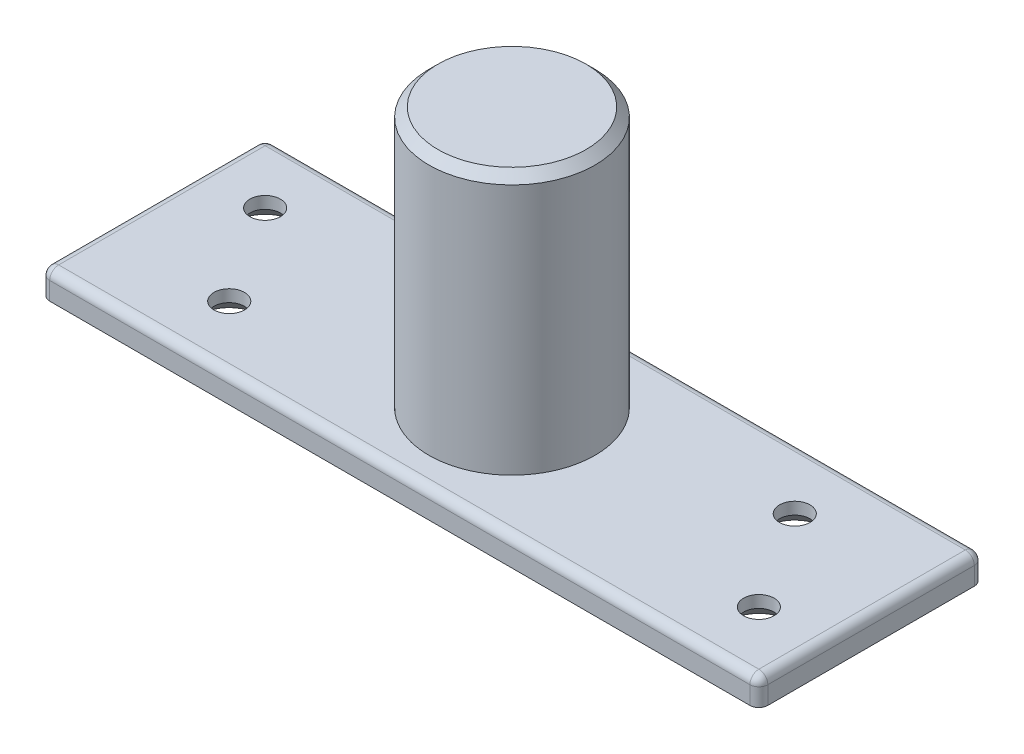
ISO-10303-21;
HEADER;
FILE_DESCRIPTION(('STEP AP214'),'2;1');
FILE_NAME('part.step','',(''),(''),'','','');
FILE_SCHEMA(('AUTOMOTIVE_DESIGN { 1 0 10303 214 1 1 1 1 }'));
ENDSEC;
DATA;
#1=APPLICATION_CONTEXT('core data for automotive mechanical design processes');
#2=APPLICATION_PROTOCOL_DEFINITION('international standard','automotive_design',2000,#1);
#3=PRODUCT_CONTEXT('',#1,'mechanical');
#4=PRODUCT('Part','Part','',(#3));
#5=PRODUCT_RELATED_PRODUCT_CATEGORY('part','',(#4));
#6=PRODUCT_DEFINITION_FORMATION('','',#4);
#7=PRODUCT_DEFINITION_CONTEXT('part definition',#1,'design');
#8=PRODUCT_DEFINITION('design','',#6,#7);
#9=PRODUCT_DEFINITION_SHAPE('','',#8);
#10=(LENGTH_UNIT() NAMED_UNIT(*) SI_UNIT(.MILLI.,.METRE.));
#11=(NAMED_UNIT(*) PLANE_ANGLE_UNIT() SI_UNIT($,.RADIAN.));
#12=(NAMED_UNIT(*) SI_UNIT($,.STERADIAN.) SOLID_ANGLE_UNIT());
#13=UNCERTAINTY_MEASURE_WITH_UNIT(LENGTH_MEASURE(1.E-05),#10,'distance_accuracy_value','');
#14=(GEOMETRIC_REPRESENTATION_CONTEXT(3) GLOBAL_UNCERTAINTY_ASSIGNED_CONTEXT((#13)) GLOBAL_UNIT_ASSIGNED_CONTEXT((#10,
#11,#12)) REPRESENTATION_CONTEXT('',''));
#15=CARTESIAN_POINT('',(0.,0.,0.));
#16=DIRECTION('',(0.,0.,1.));
#17=DIRECTION('',(1.,0.,0.));
#18=AXIS2_PLACEMENT_3D('',#15,#16,#17);
#19=CARTESIAN_POINT('',(0.,30.5,0.));
#20=DIRECTION('',(0.,-1.,0.));
#21=DIRECTION('',(0.,0.,-1.));
#22=AXIS2_PLACEMENT_3D('',#19,#20,#21);
#23=CYLINDRICAL_SURFACE('',#22,9.25);
#24=CARTESIAN_POINT('',(0.,-0.499999999999997,0.));
#25=DIRECTION('',(0.,-1.,0.));
#26=DIRECTION('',(0.,0.,-1.));
#27=AXIS2_PLACEMENT_3D('',#24,#25,#26);
#28=CIRCLE('',#27,9.25);
#29=CARTESIAN_POINT('',(0.,-0.499999999999997,-9.25));
#30=VERTEX_POINT('',#29);
#31=EDGE_CURVE('E11',#30,#30,#28,.F.);
#32=ORIENTED_EDGE('',*,*,#31,.T.);
#33=EDGE_LOOP('',(#32));
#34=FACE_BOUND('',#33,.T.);
#35=CARTESIAN_POINT('',(0.,29.5,0.));
#36=DIRECTION('',(0.,-1.,0.));
#37=DIRECTION('',(0.,0.,-1.));
#38=AXIS2_PLACEMENT_3D('',#35,#36,#37);
#39=CIRCLE('',#38,9.25);
#40=CARTESIAN_POINT('',(0.,29.5,-9.25));
#41=VERTEX_POINT('',#40);
#42=EDGE_CURVE('E72',#41,#41,#39,.T.);
#43=ORIENTED_EDGE('',*,*,#42,.T.);
#44=EDGE_LOOP('',(#43));
#45=FACE_BOUND('',#44,.T.);
#46=ADVANCED_FACE('F48',(#34,#45),#23,.T.);
#47=CARTESIAN_POINT('',(0.,30.5,0.));
#48=DIRECTION('',(0.,-1.,0.));
#49=DIRECTION('',(0.,0.,-1.));
#50=AXIS2_PLACEMENT_3D('',#47,#48,#49);
#51=PLANE('',#50);
#52=CARTESIAN_POINT('',(0.,30.5,0.));
#53=DIRECTION('',(0.,-1.,0.));
#54=DIRECTION('',(0.,0.,-1.));
#55=AXIS2_PLACEMENT_3D('',#52,#53,#54);
#56=CIRCLE('',#55,8.25);
#57=CARTESIAN_POINT('',(0.,30.5,-8.25));
#58=VERTEX_POINT('',#57);
#59=EDGE_CURVE('E69',#58,#58,#56,.F.);
#60=ORIENTED_EDGE('',*,*,#59,.T.);
#61=EDGE_LOOP('',(#60));
#62=FACE_BOUND('',#61,.T.);
#63=ADVANCED_FACE('F92',(#62),#51,.F.);
#64=CARTESIAN_POINT('',(0.,-1.5,0.));
#65=DIRECTION('',(0.,-1.,0.));
#66=DIRECTION('',(0.,0.,-1.));
#67=AXIS2_PLACEMENT_3D('',#64,#65,#66);
#68=PLANE('',#67);
#69=CARTESIAN_POINT('',(0.,-1.5,0.));
#70=DIRECTION('',(0.,-1.,0.));
#71=DIRECTION('',(0.,0.,-1.));
#72=AXIS2_PLACEMENT_3D('',#69,#70,#71);
#73=CIRCLE('',#72,7.25000000000001);
#74=CARTESIAN_POINT('',(0.,-1.5,-7.25000000000001));
#75=VERTEX_POINT('',#74);
#76=EDGE_CURVE('E56',#75,#75,#73,.F.);
#77=ORIENTED_EDGE('',*,*,#76,.T.);
#78=EDGE_LOOP('',(#77));
#79=FACE_BOUND('',#78,.T.);
#80=CARTESIAN_POINT('',(0.,-1.5,0.));
#81=DIRECTION('',(0.,-1.,0.));
#82=DIRECTION('',(0.,0.,-1.));
#83=AXIS2_PLACEMENT_3D('',#80,#81,#82);
#84=CIRCLE('',#83,8.25);
#85=CARTESIAN_POINT('',(0.,-1.5,-8.25));
#86=VERTEX_POINT('',#85);
#87=EDGE_CURVE('E60',#86,#86,#84,.T.);
#88=ORIENTED_EDGE('',*,*,#87,.T.);
#89=EDGE_LOOP('',(#88));
#90=FACE_BOUND('',#89,.T.);
#91=ADVANCED_FACE('F83',(#79,#90),#68,.T.);
#92=CARTESIAN_POINT('',(0.,30.5,0.));
#93=DIRECTION('',(0.,-1.,0.));
#94=DIRECTION('',(0.,0.,-1.));
#95=AXIS2_PLACEMENT_3D('',#92,#93,#94);
#96=CYLINDRICAL_SURFACE('',#95,6.25);
#97=CARTESIAN_POINT('',(0.,-0.49999999999999,0.));
#98=DIRECTION('',(0.,-1.,0.));
#99=DIRECTION('',(0.,0.,-1.));
#100=AXIS2_PLACEMENT_3D('',#97,#98,#99);
#101=CIRCLE('',#100,6.25);
#102=CARTESIAN_POINT('',(0.,-0.49999999999999,-6.25));
#103=VERTEX_POINT('',#102);
#104=EDGE_CURVE('E64',#103,#103,#101,.T.);
#105=ORIENTED_EDGE('',*,*,#104,.T.);
#106=EDGE_LOOP('',(#105));
#107=FACE_BOUND('',#106,.T.);
#108=CARTESIAN_POINT('',(0.,27.5,0.));
#109=DIRECTION('',(0.,-1.,0.));
#110=DIRECTION('',(0.,0.,-1.));
#111=AXIS2_PLACEMENT_3D('',#108,#109,#110);
#112=CIRCLE('',#111,6.25);
#113=CARTESIAN_POINT('',(0.,27.5,-6.25));
#114=VERTEX_POINT('',#113);
#115=EDGE_CURVE('E75',#114,#114,#112,.T.);
#116=ORIENTED_EDGE('',*,*,#115,.F.);
#117=EDGE_LOOP('',(#116));
#118=FACE_BOUND('',#117,.T.);
#119=ADVANCED_FACE('F81',(#107,#118),#96,.F.);
#120=CARTESIAN_POINT('',(0.,27.5,0.));
#121=DIRECTION('',(0.,-1.,0.));
#122=DIRECTION('',(0.,0.,-1.));
#123=AXIS2_PLACEMENT_3D('',#120,#121,#122);
#124=PLANE('',#123);
#125=ORIENTED_EDGE('',*,*,#115,.T.);
#126=EDGE_LOOP('',(#125));
#127=FACE_BOUND('',#126,.T.);
#128=ADVANCED_FACE('F79',(#127),#124,.T.);
#129=CARTESIAN_POINT('',(0.,29.5,0.));
#130=DIRECTION('',(0.,-1.,0.));
#131=DIRECTION('',(0.,0.,-1.));
#132=AXIS2_PLACEMENT_3D('',#129,#130,#131);
#133=CONICAL_SURFACE('',#132,9.25,0.785398163397449);
#134=ORIENTED_EDGE('',*,*,#59,.F.);
#135=EDGE_LOOP('',(#134));
#136=FACE_BOUND('',#135,.T.);
#137=ORIENTED_EDGE('',*,*,#42,.F.);
#138=EDGE_LOOP('',(#137));
#139=FACE_BOUND('',#138,.T.);
#140=ADVANCED_FACE('F90',(#136,#139),#133,.T.);
#141=CARTESIAN_POINT('',(0.,-0.49999999999999,0.));
#142=DIRECTION('',(0.,-1.,0.));
#143=DIRECTION('',(0.,0.,-1.));
#144=AXIS2_PLACEMENT_3D('',#141,#142,#143);
#145=CONICAL_SURFACE('',#144,6.25,0.78539816339745);
#146=ORIENTED_EDGE('',*,*,#76,.F.);
#147=EDGE_LOOP('',(#146));
#148=FACE_BOUND('',#147,.T.);
#149=ORIENTED_EDGE('',*,*,#104,.F.);
#150=EDGE_LOOP('',(#149));
#151=FACE_BOUND('',#150,.T.);
#152=ADVANCED_FACE('F108',(#148,#151),#145,.F.);
#153=CARTESIAN_POINT('',(0.,-1.5,0.));
#154=DIRECTION('',(0.,1.,0.));
#155=DIRECTION('',(0.,0.,1.));
#156=AXIS2_PLACEMENT_3D('',#153,#154,#155);
#157=CONICAL_SURFACE('',#156,8.25,0.785398163397446);
#158=ORIENTED_EDGE('',*,*,#31,.F.);
#159=EDGE_LOOP('',(#158));
#160=FACE_BOUND('',#159,.T.);
#161=ORIENTED_EDGE('',*,*,#87,.F.);
#162=EDGE_LOOP('',(#161));
#163=FACE_BOUND('',#162,.T.);
#164=ADVANCED_FACE('F51',(#160,#163),#157,.T.);
#165=CLOSED_SHELL('',(#46,#63,#91,#119,#128,#140,#152,#164));
#166=MANIFOLD_SOLID_BREP('B2',#165);
#167=CARTESIAN_POINT('',(39.,1.5,11.5));
#168=DIRECTION('',(0.,1.,0.));
#169=DIRECTION('',(0.,0.,1.));
#170=AXIS2_PLACEMENT_3D('',#167,#168,#169);
#171=PLANE('',#170);
#172=CARTESIAN_POINT('',(26.,1.5,-5.5));
#173=DIRECTION('',(0.,1.,0.));
#174=DIRECTION('',(0.,0.,1.));
#175=AXIS2_PLACEMENT_3D('',#172,#173,#174);
#176=CIRCLE('',#175,1.7);
#177=CARTESIAN_POINT('',(26.,1.5,-3.8));
#178=VERTEX_POINT('',#177);
#179=EDGE_CURVE('E192',#178,#178,#176,.T.);
#180=ORIENTED_EDGE('',*,*,#179,.F.);
#181=EDGE_LOOP('',(#180));
#182=FACE_BOUND('',#181,.T.);
#183=CARTESIAN_POINT('',(33.,1.5,5.5));
#184=DIRECTION('',(0.,1.,0.));
#185=DIRECTION('',(0.,0.,1.));
#186=AXIS2_PLACEMENT_3D('',#183,#184,#185);
#187=CIRCLE('',#186,1.7);
#188=CARTESIAN_POINT('',(33.,1.5,7.2));
#189=VERTEX_POINT('',#188);
#190=EDGE_CURVE('E372',#189,#189,#187,.T.);
#191=ORIENTED_EDGE('',*,*,#190,.F.);
#192=EDGE_LOOP('',(#191));
#193=FACE_BOUND('',#192,.T.);
#194=CARTESIAN_POINT('',(-26.,1.5,5.5));
#195=DIRECTION('',(0.,1.,0.));
#196=DIRECTION('',(0.,0.,1.));
#197=AXIS2_PLACEMENT_3D('',#194,#195,#196);
#198=CIRCLE('',#197,1.7);
#199=CARTESIAN_POINT('',(-26.,1.5,7.2));
#200=VERTEX_POINT('',#199);
#201=EDGE_CURVE('E368',#200,#200,#198,.T.);
#202=ORIENTED_EDGE('',*,*,#201,.F.);
#203=EDGE_LOOP('',(#202));
#204=FACE_BOUND('',#203,.T.);
#205=CARTESIAN_POINT('',(-33.,1.5,-5.5));
#206=DIRECTION('',(0.,1.,0.));
#207=DIRECTION('',(0.,0.,1.));
#208=AXIS2_PLACEMENT_3D('',#205,#206,#207);
#209=CIRCLE('',#208,1.7);
#210=CARTESIAN_POINT('',(-33.,1.5,-3.8));
#211=VERTEX_POINT('',#210);
#212=EDGE_CURVE('E345',#211,#211,#209,.T.);
#213=ORIENTED_EDGE('',*,*,#212,.F.);
#214=EDGE_LOOP('',(#213));
#215=FACE_BOUND('',#214,.T.);
#216=DIRECTION('',(-1.,0.,0.));
#217=VECTOR('',#216,1.);
#218=CARTESIAN_POINT('',(-39.,1.5,-11.5));
#219=LINE('',#218,#217);
#220=CARTESIAN_POINT('',(39.,1.5,-11.5));
#221=VERTEX_POINT('',#220);
#222=CARTESIAN_POINT('',(-39.,1.5,-11.5));
#223=VERTEX_POINT('',#222);
#224=EDGE_CURVE('E327',#221,#223,#219,.T.);
#225=ORIENTED_EDGE('',*,*,#224,.T.);
#226=DIRECTION('',(0.,0.,1.));
#227=VECTOR('',#226,1.);
#228=CARTESIAN_POINT('',(-39.,1.5,11.5));
#229=LINE('',#228,#227);
#230=CARTESIAN_POINT('',(-39.,1.5,11.5));
#231=VERTEX_POINT('',#230);
#232=EDGE_CURVE('E329',#223,#231,#229,.T.);
#233=ORIENTED_EDGE('',*,*,#232,.T.);
#234=DIRECTION('',(1.,0.,0.));
#235=VECTOR('',#234,1.);
#236=CARTESIAN_POINT('',(39.,1.5,11.5));
#237=LINE('',#236,#235);
#238=CARTESIAN_POINT('',(39.,1.5,11.5));
#239=VERTEX_POINT('',#238);
#240=EDGE_CURVE('E323',#231,#239,#237,.T.);
#241=ORIENTED_EDGE('',*,*,#240,.T.);
#242=DIRECTION('',(0.,0.,-1.));
#243=VECTOR('',#242,1.);
#244=CARTESIAN_POINT('',(39.,1.5,-11.5));
#245=LINE('',#244,#243);
#246=EDGE_CURVE('E325',#239,#221,#245,.T.);
#247=ORIENTED_EDGE('',*,*,#246,.T.);
#248=EDGE_LOOP('',(#225,#233,#241,#247));
#249=FACE_BOUND('',#248,.T.);
#250=CARTESIAN_POINT('',(0.,1.5,0.));
#251=DIRECTION('',(0.,1.,0.));
#252=DIRECTION('',(0.,0.,1.));
#253=AXIS2_PLACEMENT_3D('',#250,#251,#252);
#254=CIRCLE('',#253,9.25);
#255=CARTESIAN_POINT('',(0.,1.5,9.25));
#256=VERTEX_POINT('',#255);
#257=EDGE_CURVE('E287',#256,#256,#254,.T.);
#258=ORIENTED_EDGE('',*,*,#257,.F.);
#259=EDGE_LOOP('',(#258));
#260=FACE_BOUND('',#259,.T.);
#261=ADVANCED_FACE('F188',(#182,#193,#204,#215,#249,#260),#171,.T.);
#262=CARTESIAN_POINT('',(39.,-1.5,11.5));
#263=DIRECTION('',(0.,1.,0.));
#264=DIRECTION('',(0.,0.,1.));
#265=AXIS2_PLACEMENT_3D('',#262,#263,#264);
#266=PLANE('',#265);
#267=CARTESIAN_POINT('',(26.,-1.5,-5.5));
#268=DIRECTION('',(0.,-1.,0.));
#269=DIRECTION('',(0.,0.,-1.));
#270=AXIS2_PLACEMENT_3D('',#267,#268,#269);
#271=CIRCLE('',#270,3.36);
#272=CARTESIAN_POINT('',(26.,-1.5,-8.86));
#273=VERTEX_POINT('',#272);
#274=EDGE_CURVE('E543',#273,#273,#271,.T.);
#275=ORIENTED_EDGE('',*,*,#274,.F.);
#276=EDGE_LOOP('',(#275));
#277=FACE_BOUND('',#276,.T.);
#278=CARTESIAN_POINT('',(33.,-1.5,5.5));
#279=DIRECTION('',(0.,-1.,0.));
#280=DIRECTION('',(0.,0.,-1.));
#281=AXIS2_PLACEMENT_3D('',#278,#279,#280);
#282=CIRCLE('',#281,3.36);
#283=CARTESIAN_POINT('',(33.,-1.5,2.14));
#284=VERTEX_POINT('',#283);
#285=EDGE_CURVE('E381',#284,#284,#282,.T.);
#286=ORIENTED_EDGE('',*,*,#285,.F.);
#287=EDGE_LOOP('',(#286));
#288=FACE_BOUND('',#287,.T.);
#289=CARTESIAN_POINT('',(-26.,-1.5,5.5));
#290=DIRECTION('',(0.,-1.,0.));
#291=DIRECTION('',(0.,0.,-1.));
#292=AXIS2_PLACEMENT_3D('',#289,#290,#291);
#293=CIRCLE('',#292,3.36);
#294=CARTESIAN_POINT('',(-26.,-1.5,2.14));
#295=VERTEX_POINT('',#294);
#296=EDGE_CURVE('E374',#295,#295,#293,.T.);
#297=ORIENTED_EDGE('',*,*,#296,.F.);
#298=EDGE_LOOP('',(#297));
#299=FACE_BOUND('',#298,.T.);
#300=CARTESIAN_POINT('',(-33.,-1.5,-5.5));
#301=DIRECTION('',(0.,-1.,0.));
#302=DIRECTION('',(0.,0.,-1.));
#303=AXIS2_PLACEMENT_3D('',#300,#301,#302);
#304=CIRCLE('',#303,3.36);
#305=CARTESIAN_POINT('',(-33.,-1.5,-8.86));
#306=VERTEX_POINT('',#305);
#307=EDGE_CURVE('E370',#306,#306,#304,.T.);
#308=ORIENTED_EDGE('',*,*,#307,.F.);
#309=EDGE_LOOP('',(#308));
#310=FACE_BOUND('',#309,.T.);
#311=CARTESIAN_POINT('',(39.,-1.5,11.5));
#312=DIRECTION('',(0.,1.,0.));
#313=DIRECTION('',(0.,0.,1.));
#314=AXIS2_PLACEMENT_3D('',#311,#312,#313);
#315=CIRCLE('',#314,1.);
#316=CARTESIAN_POINT('',(39.,-1.5,12.5));
#317=VERTEX_POINT('',#316);
#318=CARTESIAN_POINT('',(40.,-1.5,11.5));
#319=VERTEX_POINT('',#318);
#320=EDGE_CURVE('E279',#317,#319,#315,.T.);
#321=ORIENTED_EDGE('',*,*,#320,.F.);
#322=DIRECTION('',(1.,0.,0.));
#323=VECTOR('',#322,1.);
#324=CARTESIAN_POINT('',(-39.,-1.5,12.5));
#325=LINE('',#324,#323);
#326=CARTESIAN_POINT('',(-39.,-1.5,12.5));
#327=VERTEX_POINT('',#326);
#328=EDGE_CURVE('E307',#327,#317,#325,.T.);
#329=ORIENTED_EDGE('',*,*,#328,.F.);
#330=CARTESIAN_POINT('',(-39.,-1.5,11.5));
#331=DIRECTION('',(0.,1.,0.));
#332=DIRECTION('',(0.,0.,-1.));
#333=AXIS2_PLACEMENT_3D('',#330,#331,#332);
#334=CIRCLE('',#333,1.);
#335=CARTESIAN_POINT('',(-40.,-1.5,11.5));
#336=VERTEX_POINT('',#335);
#337=EDGE_CURVE('E304',#336,#327,#334,.T.);
#338=ORIENTED_EDGE('',*,*,#337,.F.);
#339=DIRECTION('',(0.,0.,1.));
#340=VECTOR('',#339,1.);
#341=CARTESIAN_POINT('',(-40.,-1.5,11.5));
#342=LINE('',#341,#340);
#343=CARTESIAN_POINT('',(-40.,-1.5,-11.5));
#344=VERTEX_POINT('',#343);
#345=EDGE_CURVE('E301',#344,#336,#342,.T.);
#346=ORIENTED_EDGE('',*,*,#345,.F.);
#347=CARTESIAN_POINT('',(-39.,-1.5,-11.5));
#348=DIRECTION('',(0.,1.,0.));
#349=DIRECTION('',(0.,0.,-1.));
#350=AXIS2_PLACEMENT_3D('',#347,#348,#349);
#351=CIRCLE('',#350,1.);
#352=CARTESIAN_POINT('',(-39.,-1.5,-12.5));
#353=VERTEX_POINT('',#352);
#354=EDGE_CURVE('E298',#353,#344,#351,.T.);
#355=ORIENTED_EDGE('',*,*,#354,.F.);
#356=DIRECTION('',(-1.,0.,0.));
#357=VECTOR('',#356,1.);
#358=CARTESIAN_POINT('',(-39.,-1.5,-12.5));
#359=LINE('',#358,#357);
#360=CARTESIAN_POINT('',(39.,-1.5,-12.5));
#361=VERTEX_POINT('',#360);
#362=EDGE_CURVE('E295',#361,#353,#359,.T.);
#363=ORIENTED_EDGE('',*,*,#362,.F.);
#364=CARTESIAN_POINT('',(39.,-1.5,-11.5));
#365=DIRECTION('',(0.,1.,0.));
#366=DIRECTION('',(0.,0.,-1.));
#367=AXIS2_PLACEMENT_3D('',#364,#365,#366);
#368=CIRCLE('',#367,1.);
#369=CARTESIAN_POINT('',(40.,-1.5,-11.5));
#370=VERTEX_POINT('',#369);
#371=EDGE_CURVE('E282',#370,#361,#368,.T.);
#372=ORIENTED_EDGE('',*,*,#371,.F.);
#373=DIRECTION('',(0.,0.,-1.));
#374=VECTOR('',#373,1.);
#375=CARTESIAN_POINT('',(40.,-1.5,11.5));
#376=LINE('',#375,#374);
#377=EDGE_CURVE('E267',#319,#370,#376,.T.);
#378=ORIENTED_EDGE('',*,*,#377,.F.);
#379=EDGE_LOOP('',(#321,#329,#338,#346,#355,#363,#372,#378));
#380=FACE_BOUND('',#379,.T.);
#381=CARTESIAN_POINT('',(0.,-1.5,0.));
#382=DIRECTION('',(0.,1.,0.));
#383=DIRECTION('',(0.,0.,1.));
#384=AXIS2_PLACEMENT_3D('',#381,#382,#383);
#385=CIRCLE('',#384,9.25);
#386=CARTESIAN_POINT('',(0.,-1.5,9.25));
#387=VERTEX_POINT('',#386);
#388=EDGE_CURVE('E290',#387,#387,#385,.T.);
#389=ORIENTED_EDGE('',*,*,#388,.T.);
#390=EDGE_LOOP('',(#389));
#391=FACE_BOUND('',#390,.T.);
#392=ADVANCED_FACE('F276',(#277,#288,#299,#310,#380,#391),#266,.F.);
#393=CARTESIAN_POINT('',(39.,1.5,11.5));
#394=DIRECTION('',(0.,-1.,0.));
#395=DIRECTION('',(0.,0.,-1.));
#396=AXIS2_PLACEMENT_3D('',#393,#394,#395);
#397=CYLINDRICAL_SURFACE('',#396,1.);
#398=DIRECTION('',(0.,-1.,0.));
#399=VECTOR('',#398,1.);
#400=CARTESIAN_POINT('',(40.,1.5,11.5));
#401=LINE('',#400,#399);
#402=CARTESIAN_POINT('',(40.,0.5,11.5));
#403=VERTEX_POINT('',#402);
#404=EDGE_CURVE('E264',#403,#319,#401,.T.);
#405=ORIENTED_EDGE('',*,*,#404,.F.);
#406=CARTESIAN_POINT('',(39.,0.5,11.5));
#407=DIRECTION('',(0.,-1.,0.));
#408=DIRECTION('',(0.,0.,-1.));
#409=AXIS2_PLACEMENT_3D('',#406,#407,#408);
#410=CIRCLE('',#409,1.);
#411=CARTESIAN_POINT('',(39.,0.5,12.5));
#412=VERTEX_POINT('',#411);
#413=EDGE_CURVE('E197',#403,#412,#410,.T.);
#414=ORIENTED_EDGE('',*,*,#413,.T.);
#415=DIRECTION('',(0.,-1.,0.));
#416=VECTOR('',#415,1.);
#417=CARTESIAN_POINT('',(39.,1.5,12.5));
#418=LINE('',#417,#416);
#419=EDGE_CURVE('E285',#412,#317,#418,.T.);
#420=ORIENTED_EDGE('',*,*,#419,.T.);
#421=ORIENTED_EDGE('',*,*,#320,.T.);
#422=EDGE_LOOP('',(#405,#414,#420,#421));
#423=FACE_BOUND('',#422,.T.);
#424=ADVANCED_FACE('F284',(#423),#397,.T.);
#425=CARTESIAN_POINT('',(40.,1.5,11.5));
#426=DIRECTION('',(-1.,0.,0.));
#427=DIRECTION('',(0.,0.,1.));
#428=AXIS2_PLACEMENT_3D('',#425,#426,#427);
#429=PLANE('',#428);
#430=DIRECTION('',(0.,-1.,0.));
#431=VECTOR('',#430,1.);
#432=CARTESIAN_POINT('',(40.,1.5,-11.5));
#433=LINE('',#432,#431);
#434=CARTESIAN_POINT('',(40.,0.5,-11.5));
#435=VERTEX_POINT('',#434);
#436=EDGE_CURVE('E272',#435,#370,#433,.T.);
#437=ORIENTED_EDGE('',*,*,#436,.F.);
#438=DIRECTION('',(0.,0.,-1.));
#439=VECTOR('',#438,1.);
#440=CARTESIAN_POINT('',(40.,0.5,11.5));
#441=LINE('',#440,#439);
#442=EDGE_CURVE('E212',#435,#403,#441,.F.);
#443=ORIENTED_EDGE('',*,*,#442,.T.);
#444=ORIENTED_EDGE('',*,*,#404,.T.);
#445=ORIENTED_EDGE('',*,*,#377,.T.);
#446=EDGE_LOOP('',(#437,#443,#444,#445));
#447=FACE_BOUND('',#446,.T.);
#448=ADVANCED_FACE('F266',(#447),#429,.F.);
#449=CARTESIAN_POINT('',(39.,1.5,-11.5));
#450=DIRECTION('',(0.,-1.,0.));
#451=DIRECTION('',(0.,0.,-1.));
#452=AXIS2_PLACEMENT_3D('',#449,#450,#451);
#453=CYLINDRICAL_SURFACE('',#452,1.);
#454=DIRECTION('',(0.,-1.,0.));
#455=VECTOR('',#454,1.);
#456=CARTESIAN_POINT('',(39.,1.5,-12.5));
#457=LINE('',#456,#455);
#458=CARTESIAN_POINT('',(39.,0.5,-12.5));
#459=VERTEX_POINT('',#458);
#460=EDGE_CURVE('E318',#459,#361,#457,.T.);
#461=ORIENTED_EDGE('',*,*,#460,.F.);
#462=CARTESIAN_POINT('',(39.,0.5,-11.5));
#463=DIRECTION('',(0.,-1.,0.));
#464=DIRECTION('',(0.,0.,-1.));
#465=AXIS2_PLACEMENT_3D('',#462,#463,#464);
#466=CIRCLE('',#465,1.);
#467=EDGE_CURVE('E338',#459,#435,#466,.T.);
#468=ORIENTED_EDGE('',*,*,#467,.T.);
#469=ORIENTED_EDGE('',*,*,#436,.T.);
#470=ORIENTED_EDGE('',*,*,#371,.T.);
#471=EDGE_LOOP('',(#461,#468,#469,#470));
#472=FACE_BOUND('',#471,.T.);
#473=ADVANCED_FACE('F439',(#472),#453,.T.);
#474=CARTESIAN_POINT('',(-39.,1.5,-12.5));
#475=DIRECTION('',(0.,0.,1.));
#476=DIRECTION('',(1.,0.,0.));
#477=AXIS2_PLACEMENT_3D('',#474,#475,#476);
#478=PLANE('',#477);
#479=DIRECTION('',(0.,-1.,0.));
#480=VECTOR('',#479,1.);
#481=CARTESIAN_POINT('',(-39.,1.5,-12.5));
#482=LINE('',#481,#480);
#483=CARTESIAN_POINT('',(-39.,0.5,-12.5));
#484=VERTEX_POINT('',#483);
#485=EDGE_CURVE('E316',#484,#353,#482,.T.);
#486=ORIENTED_EDGE('',*,*,#485,.F.);
#487=DIRECTION('',(-1.,0.,0.));
#488=VECTOR('',#487,1.);
#489=CARTESIAN_POINT('',(39.,0.5,-12.5));
#490=LINE('',#489,#488);
#491=EDGE_CURVE('E336',#484,#459,#490,.F.);
#492=ORIENTED_EDGE('',*,*,#491,.T.);
#493=ORIENTED_EDGE('',*,*,#460,.T.);
#494=ORIENTED_EDGE('',*,*,#362,.T.);
#495=EDGE_LOOP('',(#486,#492,#493,#494));
#496=FACE_BOUND('',#495,.T.);
#497=ADVANCED_FACE('F435',(#496),#478,.F.);
#498=CARTESIAN_POINT('',(-39.,1.5,-11.5));
#499=DIRECTION('',(0.,-1.,0.));
#500=DIRECTION('',(0.,0.,-1.));
#501=AXIS2_PLACEMENT_3D('',#498,#499,#500);
#502=CYLINDRICAL_SURFACE('',#501,1.);
#503=DIRECTION('',(0.,-1.,0.));
#504=VECTOR('',#503,1.);
#505=CARTESIAN_POINT('',(-40.,1.5,-11.5));
#506=LINE('',#505,#504);
#507=CARTESIAN_POINT('',(-40.,0.5,-11.5));
#508=VERTEX_POINT('',#507);
#509=EDGE_CURVE('E314',#508,#344,#506,.T.);
#510=ORIENTED_EDGE('',*,*,#509,.F.);
#511=CARTESIAN_POINT('',(-39.,0.5,-11.5));
#512=DIRECTION('',(0.,-1.,0.));
#513=DIRECTION('',(0.,0.,-1.));
#514=AXIS2_PLACEMENT_3D('',#511,#512,#513);
#515=CIRCLE('',#514,1.);
#516=EDGE_CURVE('E334',#508,#484,#515,.T.);
#517=ORIENTED_EDGE('',*,*,#516,.T.);
#518=ORIENTED_EDGE('',*,*,#485,.T.);
#519=ORIENTED_EDGE('',*,*,#354,.T.);
#520=EDGE_LOOP('',(#510,#517,#518,#519));
#521=FACE_BOUND('',#520,.T.);
#522=ADVANCED_FACE('F431',(#521),#502,.T.);
#523=CARTESIAN_POINT('',(-40.,1.5,11.5));
#524=DIRECTION('',(1.,0.,0.));
#525=DIRECTION('',(0.,0.,-1.));
#526=AXIS2_PLACEMENT_3D('',#523,#524,#525);
#527=PLANE('',#526);
#528=DIRECTION('',(0.,-1.,0.));
#529=VECTOR('',#528,1.);
#530=CARTESIAN_POINT('',(-40.,1.5,11.5));
#531=LINE('',#530,#529);
#532=CARTESIAN_POINT('',(-40.,0.5,11.5));
#533=VERTEX_POINT('',#532);
#534=EDGE_CURVE('E312',#533,#336,#531,.T.);
#535=ORIENTED_EDGE('',*,*,#534,.F.);
#536=DIRECTION('',(0.,0.,1.));
#537=VECTOR('',#536,1.);
#538=CARTESIAN_POINT('',(-40.,0.5,-11.5));
#539=LINE('',#538,#537);
#540=EDGE_CURVE('E332',#533,#508,#539,.F.);
#541=ORIENTED_EDGE('',*,*,#540,.T.);
#542=ORIENTED_EDGE('',*,*,#509,.T.);
#543=ORIENTED_EDGE('',*,*,#345,.T.);
#544=EDGE_LOOP('',(#535,#541,#542,#543));
#545=FACE_BOUND('',#544,.T.);
#546=ADVANCED_FACE('F427',(#545),#527,.F.);
#547=CARTESIAN_POINT('',(-39.,1.5,11.5));
#548=DIRECTION('',(0.,-1.,0.));
#549=DIRECTION('',(0.,0.,-1.));
#550=AXIS2_PLACEMENT_3D('',#547,#548,#549);
#551=CYLINDRICAL_SURFACE('',#550,1.);
#552=DIRECTION('',(0.,-1.,0.));
#553=VECTOR('',#552,1.);
#554=CARTESIAN_POINT('',(-39.,1.5,12.5));
#555=LINE('',#554,#553);
#556=CARTESIAN_POINT('',(-39.,0.5,12.5));
#557=VERTEX_POINT('',#556);
#558=EDGE_CURVE('E310',#557,#327,#555,.T.);
#559=ORIENTED_EDGE('',*,*,#558,.F.);
#560=CARTESIAN_POINT('',(-39.,0.5,11.5));
#561=DIRECTION('',(0.,-1.,0.));
#562=DIRECTION('',(0.,0.,-1.));
#563=AXIS2_PLACEMENT_3D('',#560,#561,#562);
#564=CIRCLE('',#563,1.);
#565=EDGE_CURVE('E271',#557,#533,#564,.T.);
#566=ORIENTED_EDGE('',*,*,#565,.T.);
#567=ORIENTED_EDGE('',*,*,#534,.T.);
#568=ORIENTED_EDGE('',*,*,#337,.T.);
#569=EDGE_LOOP('',(#559,#566,#567,#568));
#570=FACE_BOUND('',#569,.T.);
#571=ADVANCED_FACE('F423',(#570),#551,.T.);
#572=CARTESIAN_POINT('',(-39.,1.5,12.5));
#573=DIRECTION('',(0.,0.,-1.));
#574=DIRECTION('',(-1.,0.,0.));
#575=AXIS2_PLACEMENT_3D('',#572,#573,#574);
#576=PLANE('',#575);
#577=ORIENTED_EDGE('',*,*,#419,.F.);
#578=DIRECTION('',(1.,0.,0.));
#579=VECTOR('',#578,1.);
#580=CARTESIAN_POINT('',(-39.,0.5,12.5));
#581=LINE('',#580,#579);
#582=EDGE_CURVE('E46',#412,#557,#581,.F.);
#583=ORIENTED_EDGE('',*,*,#582,.T.);
#584=ORIENTED_EDGE('',*,*,#558,.T.);
#585=ORIENTED_EDGE('',*,*,#328,.T.);
#586=EDGE_LOOP('',(#577,#583,#584,#585));
#587=FACE_BOUND('',#586,.T.);
#588=ADVANCED_FACE('F419',(#587),#576,.F.);
#589=CARTESIAN_POINT('',(0.,1.5,0.));
#590=DIRECTION('',(0.,-1.,0.));
#591=DIRECTION('',(0.,0.,-1.));
#592=AXIS2_PLACEMENT_3D('',#589,#590,#591);
#593=CYLINDRICAL_SURFACE('',#592,9.25);
#594=ORIENTED_EDGE('',*,*,#257,.T.);
#595=EDGE_LOOP('',(#594));
#596=FACE_BOUND('',#595,.T.);
#597=ORIENTED_EDGE('',*,*,#388,.F.);
#598=EDGE_LOOP('',(#597));
#599=FACE_BOUND('',#598,.T.);
#600=ADVANCED_FACE('F422',(#596,#599),#593,.F.);
#601=CARTESIAN_POINT('',(39.,0.5,-11.5));
#602=DIRECTION('',(0.,1.,0.));
#603=DIRECTION('',(0.,0.,1.));
#604=AXIS2_PLACEMENT_3D('',#601,#602,#603);
#605=SPHERICAL_SURFACE('',#604,1.);
#606=CARTESIAN_POINT('',(39.,0.5,-11.5));
#607=DIRECTION('',(0.,0.,1.));
#608=DIRECTION('',(1.,0.,0.));
#609=AXIS2_PLACEMENT_3D('',#606,#607,#608);
#610=CIRCLE('',#609,1.);
#611=EDGE_CURVE('E359',#435,#221,#610,.T.);
#612=ORIENTED_EDGE('',*,*,#611,.F.);
#613=ORIENTED_EDGE('',*,*,#467,.F.);
#614=CARTESIAN_POINT('',(39.,0.5,-11.5));
#615=DIRECTION('',(-1.,0.,0.));
#616=DIRECTION('',(0.,0.,1.));
#617=AXIS2_PLACEMENT_3D('',#614,#615,#616);
#618=CIRCLE('',#617,1.);
#619=EDGE_CURVE('E362',#221,#459,#618,.T.);
#620=ORIENTED_EDGE('',*,*,#619,.F.);
#621=EDGE_LOOP('',(#612,#613,#620));
#622=FACE_BOUND('',#621,.T.);
#623=ADVANCED_FACE('F190',(#622),#605,.T.);
#624=CARTESIAN_POINT('',(39.,0.5,-11.5));
#625=DIRECTION('',(1.,0.,0.));
#626=DIRECTION('',(0.,0.,-1.));
#627=AXIS2_PLACEMENT_3D('',#624,#625,#626);
#628=CYLINDRICAL_SURFACE('',#627,1.);
#629=ORIENTED_EDGE('',*,*,#619,.T.);
#630=ORIENTED_EDGE('',*,*,#491,.F.);
#631=CARTESIAN_POINT('',(-39.,0.5,-11.5));
#632=DIRECTION('',(-1.,0.,0.));
#633=DIRECTION('',(0.,0.,1.));
#634=AXIS2_PLACEMENT_3D('',#631,#632,#633);
#635=CIRCLE('',#634,1.);
#636=EDGE_CURVE('E356',#223,#484,#635,.T.);
#637=ORIENTED_EDGE('',*,*,#636,.F.);
#638=ORIENTED_EDGE('',*,*,#224,.F.);
#639=EDGE_LOOP('',(#629,#630,#637,#638));
#640=FACE_BOUND('',#639,.T.);
#641=ADVANCED_FACE('F468',(#640),#628,.T.);
#642=CARTESIAN_POINT('',(39.,0.5,11.5));
#643=DIRECTION('',(0.,0.,1.));
#644=DIRECTION('',(1.,0.,0.));
#645=AXIS2_PLACEMENT_3D('',#642,#643,#644);
#646=CYLINDRICAL_SURFACE('',#645,1.);
#647=ORIENTED_EDGE('',*,*,#611,.T.);
#648=ORIENTED_EDGE('',*,*,#246,.F.);
#649=CARTESIAN_POINT('',(39.,0.5,11.5));
#650=DIRECTION('',(0.,0.,1.));
#651=DIRECTION('',(1.,0.,0.));
#652=AXIS2_PLACEMENT_3D('',#649,#650,#651);
#653=CIRCLE('',#652,1.);
#654=EDGE_CURVE('E353',#403,#239,#653,.T.);
#655=ORIENTED_EDGE('',*,*,#654,.F.);
#656=ORIENTED_EDGE('',*,*,#442,.F.);
#657=EDGE_LOOP('',(#647,#648,#655,#656));
#658=FACE_BOUND('',#657,.T.);
#659=ADVANCED_FACE('F465',(#658),#646,.T.);
#660=CARTESIAN_POINT('',(-39.,0.5,-11.5));
#661=DIRECTION('',(0.,1.,0.));
#662=DIRECTION('',(0.,0.,1.));
#663=AXIS2_PLACEMENT_3D('',#660,#661,#662);
#664=SPHERICAL_SURFACE('',#663,1.);
#665=ORIENTED_EDGE('',*,*,#636,.T.);
#666=ORIENTED_EDGE('',*,*,#516,.F.);
#667=CARTESIAN_POINT('',(-39.,0.5,-11.5));
#668=DIRECTION('',(0.,0.,1.));
#669=DIRECTION('',(1.,0.,0.));
#670=AXIS2_PLACEMENT_3D('',#667,#668,#669);
#671=CIRCLE('',#670,1.);
#672=EDGE_CURVE('E350',#223,#508,#671,.T.);
#673=ORIENTED_EDGE('',*,*,#672,.F.);
#674=EDGE_LOOP('',(#665,#666,#673));
#675=FACE_BOUND('',#674,.T.);
#676=ADVANCED_FACE('F461',(#675),#664,.T.);
#677=CARTESIAN_POINT('',(39.,0.5,11.5));
#678=DIRECTION('',(0.,1.,0.));
#679=DIRECTION('',(0.,0.,1.));
#680=AXIS2_PLACEMENT_3D('',#677,#678,#679);
#681=SPHERICAL_SURFACE('',#680,1.);
#682=ORIENTED_EDGE('',*,*,#413,.F.);
#683=ORIENTED_EDGE('',*,*,#654,.T.);
#684=CARTESIAN_POINT('',(39.,0.5,11.5));
#685=DIRECTION('',(-1.,0.,0.));
#686=DIRECTION('',(0.,0.,1.));
#687=AXIS2_PLACEMENT_3D('',#684,#685,#686);
#688=CIRCLE('',#687,1.);
#689=EDGE_CURVE('E347',#412,#239,#688,.T.);
#690=ORIENTED_EDGE('',*,*,#689,.F.);
#691=EDGE_LOOP('',(#682,#683,#690));
#692=FACE_BOUND('',#691,.T.);
#693=ADVANCED_FACE('F457',(#692),#681,.T.);
#694=CARTESIAN_POINT('',(-39.,0.5,11.5));
#695=DIRECTION('',(0.,0.,-1.));
#696=DIRECTION('',(-1.,0.,0.));
#697=AXIS2_PLACEMENT_3D('',#694,#695,#696);
#698=CYLINDRICAL_SURFACE('',#697,1.);
#699=ORIENTED_EDGE('',*,*,#672,.T.);
#700=ORIENTED_EDGE('',*,*,#540,.F.);
#701=CARTESIAN_POINT('',(-39.,0.5,11.5));
#702=DIRECTION('',(0.,0.,1.));
#703=DIRECTION('',(1.,0.,0.));
#704=AXIS2_PLACEMENT_3D('',#701,#702,#703);
#705=CIRCLE('',#704,1.);
#706=EDGE_CURVE('E344',#231,#533,#705,.T.);
#707=ORIENTED_EDGE('',*,*,#706,.F.);
#708=ORIENTED_EDGE('',*,*,#232,.F.);
#709=EDGE_LOOP('',(#699,#700,#707,#708));
#710=FACE_BOUND('',#709,.T.);
#711=ADVANCED_FACE('F453',(#710),#698,.T.);
#712=CARTESIAN_POINT('',(39.,0.5,11.5));
#713=DIRECTION('',(-1.,0.,0.));
#714=DIRECTION('',(0.,0.,1.));
#715=AXIS2_PLACEMENT_3D('',#712,#713,#714);
#716=CYLINDRICAL_SURFACE('',#715,1.);
#717=ORIENTED_EDGE('',*,*,#689,.T.);
#718=ORIENTED_EDGE('',*,*,#240,.F.);
#719=CARTESIAN_POINT('',(-39.,0.5,11.5));
#720=DIRECTION('',(-1.,0.,0.));
#721=DIRECTION('',(0.,-1.,0.));
#722=AXIS2_PLACEMENT_3D('',#719,#720,#721);
#723=CIRCLE('',#722,1.);
#724=EDGE_CURVE('E342',#557,#231,#723,.T.);
#725=ORIENTED_EDGE('',*,*,#724,.F.);
#726=ORIENTED_EDGE('',*,*,#582,.F.);
#727=EDGE_LOOP('',(#717,#718,#725,#726));
#728=FACE_BOUND('',#727,.T.);
#729=ADVANCED_FACE('F449',(#728),#716,.T.);
#730=CARTESIAN_POINT('',(-39.,0.5,11.5));
#731=DIRECTION('',(0.,1.,0.));
#732=DIRECTION('',(0.,0.,1.));
#733=AXIS2_PLACEMENT_3D('',#730,#731,#732);
#734=SPHERICAL_SURFACE('',#733,1.);
#735=ORIENTED_EDGE('',*,*,#706,.T.);
#736=ORIENTED_EDGE('',*,*,#565,.F.);
#737=ORIENTED_EDGE('',*,*,#724,.T.);
#738=EDGE_LOOP('',(#735,#736,#737));
#739=FACE_BOUND('',#738,.T.);
#740=ADVANCED_FACE('F446',(#739),#734,.T.);
#741=CARTESIAN_POINT('',(-33.,-1.5,-5.5));
#742=DIRECTION('',(0.,-1.,0.));
#743=DIRECTION('',(0.,0.,-1.));
#744=AXIS2_PLACEMENT_3D('',#741,#742,#743);
#745=CYLINDRICAL_SURFACE('',#744,1.7);
#746=ORIENTED_EDGE('',*,*,#212,.T.);
#747=EDGE_LOOP('',(#746));
#748=FACE_BOUND('',#747,.T.);
#749=CARTESIAN_POINT('',(-33.,0.160000000000001,-5.5));
#750=DIRECTION('',(0.,-1.,0.));
#751=DIRECTION('',(0.,0.,-1.));
#752=AXIS2_PLACEMENT_3D('',#749,#750,#751);
#753=CIRCLE('',#752,1.7);
#754=CARTESIAN_POINT('',(-33.,0.160000000000001,-7.2));
#755=VERTEX_POINT('',#754);
#756=EDGE_CURVE('E367',#755,#755,#753,.T.);
#757=ORIENTED_EDGE('',*,*,#756,.T.);
#758=EDGE_LOOP('',(#757));
#759=FACE_BOUND('',#758,.T.);
#760=ADVANCED_FACE('F396',(#748,#759),#745,.F.);
#761=CARTESIAN_POINT('',(-33.,-1.5,-5.5));
#762=DIRECTION('',(0.,-1.,0.));
#763=DIRECTION('',(0.,0.,-1.));
#764=AXIS2_PLACEMENT_3D('',#761,#762,#763);
#765=CONICAL_SURFACE('',#764,3.36,0.785398163397448);
#766=ORIENTED_EDGE('',*,*,#756,.F.);
#767=EDGE_LOOP('',(#766));
#768=FACE_BOUND('',#767,.T.);
#769=ORIENTED_EDGE('',*,*,#307,.T.);
#770=EDGE_LOOP('',(#769));
#771=FACE_BOUND('',#770,.T.);
#772=ADVANCED_FACE('F398',(#768,#771),#765,.F.);
#773=CARTESIAN_POINT('',(-26.,-1.5,5.5));
#774=DIRECTION('',(0.,-1.,0.));
#775=DIRECTION('',(0.,0.,-1.));
#776=AXIS2_PLACEMENT_3D('',#773,#774,#775);
#777=CYLINDRICAL_SURFACE('',#776,1.7);
#778=ORIENTED_EDGE('',*,*,#201,.T.);
#779=EDGE_LOOP('',(#778));
#780=FACE_BOUND('',#779,.T.);
#781=CARTESIAN_POINT('',(-26.,0.160000000000001,5.5));
#782=DIRECTION('',(0.,-1.,0.));
#783=DIRECTION('',(0.,0.,-1.));
#784=AXIS2_PLACEMENT_3D('',#781,#782,#783);
#785=CIRCLE('',#784,1.7);
#786=CARTESIAN_POINT('',(-26.,0.160000000000001,3.8));
#787=VERTEX_POINT('',#786);
#788=EDGE_CURVE('E371',#787,#787,#785,.T.);
#789=ORIENTED_EDGE('',*,*,#788,.T.);
#790=EDGE_LOOP('',(#789));
#791=FACE_BOUND('',#790,.T.);
#792=ADVANCED_FACE('F401',(#780,#791),#777,.F.);
#793=CARTESIAN_POINT('',(-26.,-1.5,5.5));
#794=DIRECTION('',(0.,-1.,0.));
#795=DIRECTION('',(0.,0.,-1.));
#796=AXIS2_PLACEMENT_3D('',#793,#794,#795);
#797=CONICAL_SURFACE('',#796,3.36,0.785398163397448);
#798=ORIENTED_EDGE('',*,*,#788,.F.);
#799=EDGE_LOOP('',(#798));
#800=FACE_BOUND('',#799,.T.);
#801=ORIENTED_EDGE('',*,*,#296,.T.);
#802=EDGE_LOOP('',(#801));
#803=FACE_BOUND('',#802,.T.);
#804=ADVANCED_FACE('F517',(#800,#803),#797,.F.);
#805=CARTESIAN_POINT('',(33.,-1.5,5.5));
#806=DIRECTION('',(0.,-1.,0.));
#807=DIRECTION('',(0.,0.,-1.));
#808=AXIS2_PLACEMENT_3D('',#805,#806,#807);
#809=CYLINDRICAL_SURFACE('',#808,1.7);
#810=ORIENTED_EDGE('',*,*,#190,.T.);
#811=EDGE_LOOP('',(#810));
#812=FACE_BOUND('',#811,.T.);
#813=CARTESIAN_POINT('',(33.,0.160000000000001,5.5));
#814=DIRECTION('',(0.,-1.,0.));
#815=DIRECTION('',(0.,0.,-1.));
#816=AXIS2_PLACEMENT_3D('',#813,#814,#815);
#817=CIRCLE('',#816,1.7);
#818=CARTESIAN_POINT('',(33.,0.160000000000001,3.8));
#819=VERTEX_POINT('',#818);
#820=EDGE_CURVE('E375',#819,#819,#817,.T.);
#821=ORIENTED_EDGE('',*,*,#820,.T.);
#822=EDGE_LOOP('',(#821));
#823=FACE_BOUND('',#822,.T.);
#824=ADVANCED_FACE('F521',(#812,#823),#809,.F.);
#825=CARTESIAN_POINT('',(33.,-1.5,5.5));
#826=DIRECTION('',(0.,-1.,0.));
#827=DIRECTION('',(0.,0.,-1.));
#828=AXIS2_PLACEMENT_3D('',#825,#826,#827);
#829=CONICAL_SURFACE('',#828,3.36,0.785398163397448);
#830=ORIENTED_EDGE('',*,*,#820,.F.);
#831=EDGE_LOOP('',(#830));
#832=FACE_BOUND('',#831,.T.);
#833=ORIENTED_EDGE('',*,*,#285,.T.);
#834=EDGE_LOOP('',(#833));
#835=FACE_BOUND('',#834,.T.);
#836=ADVANCED_FACE('F525',(#832,#835),#829,.F.);
#837=CARTESIAN_POINT('',(26.,-1.5,-5.5));
#838=DIRECTION('',(0.,-1.,0.));
#839=DIRECTION('',(0.,0.,-1.));
#840=AXIS2_PLACEMENT_3D('',#837,#838,#839);
#841=CYLINDRICAL_SURFACE('',#840,1.7);
#842=ORIENTED_EDGE('',*,*,#179,.T.);
#843=EDGE_LOOP('',(#842));
#844=FACE_BOUND('',#843,.T.);
#845=CARTESIAN_POINT('',(26.,0.160000000000001,-5.5));
#846=DIRECTION('',(0.,-1.,0.));
#847=DIRECTION('',(0.,0.,-1.));
#848=AXIS2_PLACEMENT_3D('',#845,#846,#847);
#849=CIRCLE('',#848,1.7);
#850=CARTESIAN_POINT('',(26.,0.160000000000001,-7.2));
#851=VERTEX_POINT('',#850);
#852=EDGE_CURVE('E541',#851,#851,#849,.T.);
#853=ORIENTED_EDGE('',*,*,#852,.T.);
#854=EDGE_LOOP('',(#853));
#855=FACE_BOUND('',#854,.T.);
#856=ADVANCED_FACE('F528',(#844,#855),#841,.F.);
#857=CARTESIAN_POINT('',(26.,-1.5,-5.5));
#858=DIRECTION('',(0.,-1.,0.));
#859=DIRECTION('',(0.,0.,-1.));
#860=AXIS2_PLACEMENT_3D('',#857,#858,#859);
#861=CONICAL_SURFACE('',#860,3.36,0.785398163397448);
#862=ORIENTED_EDGE('',*,*,#852,.F.);
#863=EDGE_LOOP('',(#862));
#864=FACE_BOUND('',#863,.T.);
#865=ORIENTED_EDGE('',*,*,#274,.T.);
#866=EDGE_LOOP('',(#865));
#867=FACE_BOUND('',#866,.T.);
#868=ADVANCED_FACE('F532',(#864,#867),#861,.F.);
#869=CLOSED_SHELL('',(#261,#392,#424,#448,#473,#497,#522,#546,#571,#588,#600,#623,#641,#659,
#676,#693,#711,#729,#740,#760,#772,#792,#804,#824,#836,#856,#868));
#870=MANIFOLD_SOLID_BREP('B6',#869);
#871=ADVANCED_BREP_SHAPE_REPRESENTATION('',(#18,#166,#870),#14);
#872=SHAPE_DEFINITION_REPRESENTATION(#9,#871);
ENDSEC;
END-ISO-10303-21;
